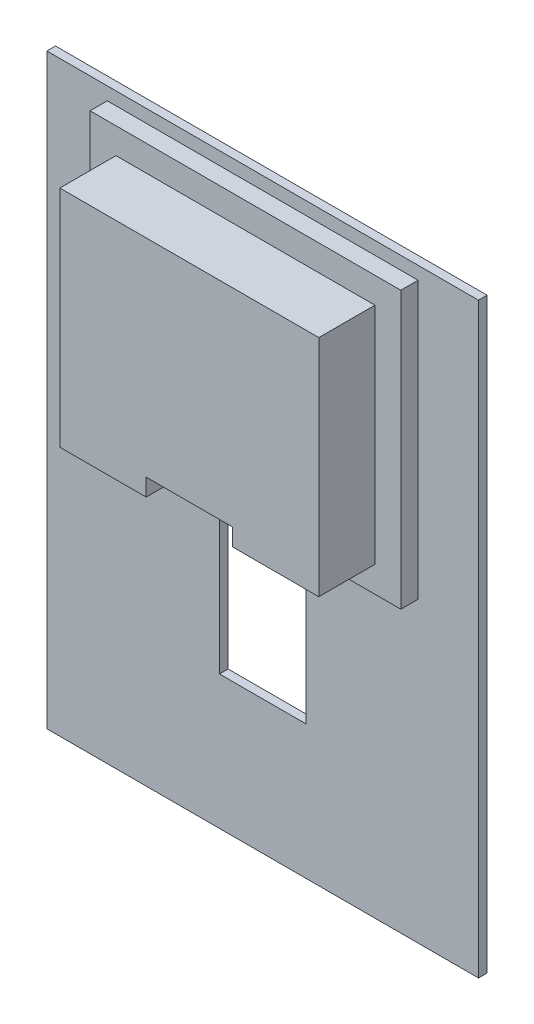
ISO-10303-21;
HEADER;
FILE_DESCRIPTION(('STEP AP214'),'2;1');
FILE_NAME('part.step','',(''),(''),'','','');
FILE_SCHEMA(('AUTOMOTIVE_DESIGN { 1 0 10303 214 1 1 1 1 }'));
ENDSEC;
DATA;
#1=APPLICATION_CONTEXT('core data for automotive mechanical design processes');
#2=APPLICATION_PROTOCOL_DEFINITION('international standard','automotive_design',2000,#1);
#3=PRODUCT_CONTEXT('',#1,'mechanical');
#4=PRODUCT('Part','Part','',(#3));
#5=PRODUCT_RELATED_PRODUCT_CATEGORY('part','',(#4));
#6=PRODUCT_DEFINITION_FORMATION('','',#4);
#7=PRODUCT_DEFINITION_CONTEXT('part definition',#1,'design');
#8=PRODUCT_DEFINITION('design','',#6,#7);
#9=PRODUCT_DEFINITION_SHAPE('','',#8);
#10=(LENGTH_UNIT() NAMED_UNIT(*) SI_UNIT(.MILLI.,.METRE.));
#11=(NAMED_UNIT(*) PLANE_ANGLE_UNIT() SI_UNIT($,.RADIAN.));
#12=(NAMED_UNIT(*) SI_UNIT($,.STERADIAN.) SOLID_ANGLE_UNIT());
#13=UNCERTAINTY_MEASURE_WITH_UNIT(LENGTH_MEASURE(1.E-05),#10,'distance_accuracy_value','');
#14=(GEOMETRIC_REPRESENTATION_CONTEXT(3) GLOBAL_UNCERTAINTY_ASSIGNED_CONTEXT((#13)) GLOBAL_UNIT_ASSIGNED_CONTEXT((#10,
#11,#12)) REPRESENTATION_CONTEXT('',''));
#15=CARTESIAN_POINT('',(0.,0.,0.));
#16=DIRECTION('',(0.,0.,1.));
#17=DIRECTION('',(1.,0.,0.));
#18=AXIS2_PLACEMENT_3D('',#15,#16,#17);
#19=CARTESIAN_POINT('',(-28.,8.99999999999999,4.));
#20=DIRECTION('',(0.,-1.,0.));
#21=DIRECTION('',(0.,0.,-1.));
#22=AXIS2_PLACEMENT_3D('',#19,#20,#21);
#23=PLANE('',#22);
#24=DIRECTION('',(1.,0.,0.));
#25=VECTOR('',#24,1.);
#26=CARTESIAN_POINT('',(-28.,8.99999999999999,17.));
#27=LINE('',#26,#25);
#28=CARTESIAN_POINT('',(-28.,8.99999999999999,17.));
#29=VERTEX_POINT('',#28);
#30=CARTESIAN_POINT('',(-10.,8.99999999999999,17.));
#31=VERTEX_POINT('',#30);
#32=EDGE_CURVE('E290',#29,#31,#27,.T.);
#33=ORIENTED_EDGE('',*,*,#32,.T.);
#34=DIRECTION('',(0.,0.,-1.));
#35=VECTOR('',#34,1.);
#36=CARTESIAN_POINT('',(-10.,8.99999999999999,4.));
#37=LINE('',#36,#35);
#38=CARTESIAN_POINT('',(-10.,8.99999999999999,4.));
#39=VERTEX_POINT('',#38);
#40=EDGE_CURVE('E278',#31,#39,#37,.T.);
#41=ORIENTED_EDGE('',*,*,#40,.T.);
#42=DIRECTION('',(1.,0.,0.));
#43=VECTOR('',#42,1.);
#44=CARTESIAN_POINT('',(-28.,8.99999999999999,4.));
#45=LINE('',#44,#43);
#46=CARTESIAN_POINT('',(-28.,8.99999999999999,4.));
#47=VERTEX_POINT('',#46);
#48=EDGE_CURVE('E332',#47,#39,#45,.T.);
#49=ORIENTED_EDGE('',*,*,#48,.F.);
#50=DIRECTION('',(0.,0.,1.));
#51=VECTOR('',#50,1.);
#52=CARTESIAN_POINT('',(-28.,8.99999999999999,4.));
#53=LINE('',#52,#51);
#54=EDGE_CURVE('E341',#47,#29,#53,.T.);
#55=ORIENTED_EDGE('',*,*,#54,.T.);
#56=EDGE_LOOP('',(#33,#41,#49,#55));
#57=FACE_BOUND('',#56,.T.);
#58=ADVANCED_FACE('F37',(#57),#23,.F.);
#59=CARTESIAN_POINT('',(-30.,6.99999999999999,19.));
#60=DIRECTION('',(0.,1.,0.));
#61=DIRECTION('',(0.,0.,1.));
#62=AXIS2_PLACEMENT_3D('',#59,#60,#61);
#63=PLANE('',#62);
#64=DIRECTION('',(1.,0.,0.));
#65=VECTOR('',#64,1.);
#66=CARTESIAN_POINT('',(-30.,6.99999999999999,6.));
#67=LINE('',#66,#65);
#68=CARTESIAN_POINT('',(-30.,6.99999999999999,6.));
#69=VERTEX_POINT('',#68);
#70=CARTESIAN_POINT('',(-10.,6.99999999999999,6.));
#71=VERTEX_POINT('',#70);
#72=EDGE_CURVE('E312',#69,#71,#67,.T.);
#73=ORIENTED_EDGE('',*,*,#72,.T.);
#74=DIRECTION('',(0.,0.,1.));
#75=VECTOR('',#74,1.);
#76=CARTESIAN_POINT('',(-10.,6.99999999999999,19.));
#77=LINE('',#76,#75);
#78=CARTESIAN_POINT('',(-10.,6.99999999999999,19.));
#79=VERTEX_POINT('',#78);
#80=EDGE_CURVE('E283',#71,#79,#77,.T.);
#81=ORIENTED_EDGE('',*,*,#80,.T.);
#82=DIRECTION('',(1.,0.,0.));
#83=VECTOR('',#82,1.);
#84=CARTESIAN_POINT('',(-30.,6.99999999999999,19.));
#85=LINE('',#84,#83);
#86=CARTESIAN_POINT('',(-30.,6.99999999999999,19.));
#87=VERTEX_POINT('',#86);
#88=EDGE_CURVE('E302',#87,#79,#85,.T.);
#89=ORIENTED_EDGE('',*,*,#88,.F.);
#90=DIRECTION('',(0.,0.,-1.));
#91=VECTOR('',#90,1.);
#92=CARTESIAN_POINT('',(-30.,6.99999999999999,19.));
#93=LINE('',#92,#91);
#94=EDGE_CURVE('E326',#87,#69,#93,.T.);
#95=ORIENTED_EDGE('',*,*,#94,.T.);
#96=EDGE_LOOP('',(#73,#81,#89,#95));
#97=FACE_BOUND('',#96,.T.);
#98=ADVANCED_FACE('F575',(#97),#63,.F.);
#99=CARTESIAN_POINT('',(-28.,57.,4.));
#100=DIRECTION('',(-1.,0.,0.));
#101=DIRECTION('',(0.,-1.,0.));
#102=AXIS2_PLACEMENT_3D('',#99,#100,#101);
#103=PLANE('',#102);
#104=DIRECTION('',(0.,-1.,0.));
#105=VECTOR('',#104,1.);
#106=CARTESIAN_POINT('',(-28.,57.,17.));
#107=LINE('',#106,#105);
#108=CARTESIAN_POINT('',(-28.,57.,17.));
#109=VERTEX_POINT('',#108);
#110=EDGE_CURVE('E286',#109,#29,#107,.T.);
#111=ORIENTED_EDGE('',*,*,#110,.T.);
#112=ORIENTED_EDGE('',*,*,#54,.F.);
#113=DIRECTION('',(0.,-1.,0.));
#114=VECTOR('',#113,1.);
#115=CARTESIAN_POINT('',(-28.,57.,4.));
#116=LINE('',#115,#114);
#117=CARTESIAN_POINT('',(-28.,57.,4.));
#118=VERTEX_POINT('',#117);
#119=EDGE_CURVE('E328',#118,#47,#116,.T.);
#120=ORIENTED_EDGE('',*,*,#119,.F.);
#121=DIRECTION('',(0.,0.,1.));
#122=VECTOR('',#121,1.);
#123=CARTESIAN_POINT('',(-28.,57.,4.));
#124=LINE('',#123,#122);
#125=EDGE_CURVE('E342',#118,#109,#124,.T.);
#126=ORIENTED_EDGE('',*,*,#125,.T.);
#127=EDGE_LOOP('',(#111,#112,#120,#126));
#128=FACE_BOUND('',#127,.T.);
#129=ADVANCED_FACE('F502',(#128),#103,.F.);
#130=CARTESIAN_POINT('',(-28.,57.,4.));
#131=DIRECTION('',(0.,1.,0.));
#132=DIRECTION('',(0.,0.,1.));
#133=AXIS2_PLACEMENT_3D('',#130,#131,#132);
#134=PLANE('',#133);
#135=DIRECTION('',(-1.,0.,0.));
#136=VECTOR('',#135,1.);
#137=CARTESIAN_POINT('',(-28.,57.,17.));
#138=LINE('',#137,#136);
#139=CARTESIAN_POINT('',(28.,57.,17.));
#140=VERTEX_POINT('',#139);
#141=EDGE_CURVE('E60',#140,#109,#138,.T.);
#142=ORIENTED_EDGE('',*,*,#141,.T.);
#143=ORIENTED_EDGE('',*,*,#125,.F.);
#144=DIRECTION('',(-1.,0.,0.));
#145=VECTOR('',#144,1.);
#146=CARTESIAN_POINT('',(-28.,57.,4.));
#147=LINE('',#146,#145);
#148=CARTESIAN_POINT('',(28.,57.,4.));
#149=VERTEX_POINT('',#148);
#150=EDGE_CURVE('E338',#149,#118,#147,.T.);
#151=ORIENTED_EDGE('',*,*,#150,.F.);
#152=DIRECTION('',(0.,0.,1.));
#153=VECTOR('',#152,1.);
#154=CARTESIAN_POINT('',(28.,57.,4.));
#155=LINE('',#154,#153);
#156=EDGE_CURVE('E345',#149,#140,#155,.T.);
#157=ORIENTED_EDGE('',*,*,#156,.T.);
#158=EDGE_LOOP('',(#142,#143,#151,#157));
#159=FACE_BOUND('',#158,.T.);
#160=ADVANCED_FACE('F498',(#159),#134,.F.);
#161=CARTESIAN_POINT('',(28.,57.,4.));
#162=DIRECTION('',(1.,0.,0.));
#163=DIRECTION('',(0.,1.,0.));
#164=AXIS2_PLACEMENT_3D('',#161,#162,#163);
#165=PLANE('',#164);
#166=DIRECTION('',(0.,1.,0.));
#167=VECTOR('',#166,1.);
#168=CARTESIAN_POINT('',(28.,57.,17.));
#169=LINE('',#168,#167);
#170=CARTESIAN_POINT('',(28.,8.99999999999999,17.));
#171=VERTEX_POINT('',#170);
#172=EDGE_CURVE('E293',#171,#140,#169,.T.);
#173=ORIENTED_EDGE('',*,*,#172,.T.);
#174=ORIENTED_EDGE('',*,*,#156,.F.);
#175=DIRECTION('',(0.,1.,0.));
#176=VECTOR('',#175,1.);
#177=CARTESIAN_POINT('',(28.,57.,4.));
#178=LINE('',#177,#176);
#179=CARTESIAN_POINT('',(28.,8.99999999999999,4.));
#180=VERTEX_POINT('',#179);
#181=EDGE_CURVE('E335',#180,#149,#178,.T.);
#182=ORIENTED_EDGE('',*,*,#181,.F.);
#183=DIRECTION('',(0.,0.,1.));
#184=VECTOR('',#183,1.);
#185=CARTESIAN_POINT('',(28.,8.99999999999999,4.));
#186=LINE('',#185,#184);
#187=EDGE_CURVE('E347',#180,#171,#186,.T.);
#188=ORIENTED_EDGE('',*,*,#187,.T.);
#189=EDGE_LOOP('',(#173,#174,#182,#188));
#190=FACE_BOUND('',#189,.T.);
#191=ADVANCED_FACE('F496',(#190),#165,.F.);
#192=CARTESIAN_POINT('',(9.99999999999998,8.99999999999999,4.));
#193=VERTEX_POINT('',#192);
#194=EDGE_CURVE('E331',#193,#180,#45,.T.);
#195=ORIENTED_EDGE('',*,*,#194,.F.);
#196=DIRECTION('',(0.,0.,1.));
#197=VECTOR('',#196,1.);
#198=CARTESIAN_POINT('',(9.99999999999998,8.99999999999999,4.));
#199=LINE('',#198,#197);
#200=CARTESIAN_POINT('',(9.99999999999998,8.99999999999999,17.));
#201=VERTEX_POINT('',#200);
#202=EDGE_CURVE('E270',#193,#201,#199,.T.);
#203=ORIENTED_EDGE('',*,*,#202,.T.);
#204=EDGE_CURVE('E289',#201,#171,#27,.T.);
#205=ORIENTED_EDGE('',*,*,#204,.T.);
#206=ORIENTED_EDGE('',*,*,#187,.F.);
#207=EDGE_LOOP('',(#195,#203,#205,#206));
#208=FACE_BOUND('',#207,.T.);
#209=ADVANCED_FACE('F489',(#208),#23,.F.);
#210=CARTESIAN_POINT('',(0.,0.,6.));
#211=DIRECTION('',(0.,0.,1.));
#212=DIRECTION('',(1.,0.,0.));
#213=AXIS2_PLACEMENT_3D('',#210,#211,#212);
#214=PLANE('',#213);
#215=DIRECTION('',(0.,1.,0.));
#216=VECTOR('',#215,1.);
#217=CARTESIAN_POINT('',(-10.,0.,6.));
#218=LINE('',#217,#216);
#219=CARTESIAN_POINT('',(-10.,0.999999999999989,6.));
#220=VERTEX_POINT('',#219);
#221=EDGE_CURVE('E375',#220,#71,#218,.T.);
#222=ORIENTED_EDGE('',*,*,#221,.T.);
#223=ORIENTED_EDGE('',*,*,#72,.F.);
#224=DIRECTION('',(0.,-1.,0.));
#225=VECTOR('',#224,1.);
#226=CARTESIAN_POINT('',(-30.,59.,6.));
#227=LINE('',#226,#225);
#228=CARTESIAN_POINT('',(-30.,59.,6.));
#229=VERTEX_POINT('',#228);
#230=EDGE_CURVE('E296',#229,#69,#227,.T.);
#231=ORIENTED_EDGE('',*,*,#230,.F.);
#232=DIRECTION('',(-1.,0.,0.));
#233=VECTOR('',#232,1.);
#234=CARTESIAN_POINT('',(-30.,59.,6.));
#235=LINE('',#234,#233);
#236=CARTESIAN_POINT('',(30.,59.,6.));
#237=VERTEX_POINT('',#236);
#238=EDGE_CURVE('E301',#237,#229,#235,.T.);
#239=ORIENTED_EDGE('',*,*,#238,.F.);
#240=DIRECTION('',(0.,1.,0.));
#241=VECTOR('',#240,1.);
#242=CARTESIAN_POINT('',(30.,59.,6.));
#243=LINE('',#242,#241);
#244=CARTESIAN_POINT('',(30.,6.99999999999999,6.));
#245=VERTEX_POINT('',#244);
#246=EDGE_CURVE('E315',#245,#237,#243,.T.);
#247=ORIENTED_EDGE('',*,*,#246,.F.);
#248=CARTESIAN_POINT('',(9.99999999999998,6.99999999999999,6.));
#249=VERTEX_POINT('',#248);
#250=EDGE_CURVE('E311',#249,#245,#67,.T.);
#251=ORIENTED_EDGE('',*,*,#250,.F.);
#252=DIRECTION('',(0.,-1.,0.));
#253=VECTOR('',#252,1.);
#254=CARTESIAN_POINT('',(9.99999999999998,0.,6.));
#255=LINE('',#254,#253);
#256=CARTESIAN_POINT('',(9.99999999999998,0.999999999999989,6.));
#257=VERTEX_POINT('',#256);
#258=EDGE_CURVE('E378',#249,#257,#255,.T.);
#259=ORIENTED_EDGE('',*,*,#258,.T.);
#260=DIRECTION('',(1.,0.,0.));
#261=VECTOR('',#260,1.);
#262=CARTESIAN_POINT('',(0.,0.999999999999989,6.));
#263=LINE('',#262,#261);
#264=CARTESIAN_POINT('',(36.,0.999999999999989,6.));
#265=VERTEX_POINT('',#264);
#266=EDGE_CURVE('E376',#257,#265,#263,.T.);
#267=ORIENTED_EDGE('',*,*,#266,.T.);
#268=DIRECTION('',(0.,-1.,0.));
#269=VECTOR('',#268,1.);
#270=CARTESIAN_POINT('',(36.,0.,6.));
#271=LINE('',#270,#269);
#272=CARTESIAN_POINT('',(36.,65.,6.));
#273=VERTEX_POINT('',#272);
#274=EDGE_CURVE('E364',#273,#265,#271,.T.);
#275=ORIENTED_EDGE('',*,*,#274,.F.);
#276=DIRECTION('',(1.,0.,0.));
#277=VECTOR('',#276,1.);
#278=CARTESIAN_POINT('',(0.,65.,6.));
#279=LINE('',#278,#277);
#280=CARTESIAN_POINT('',(-36.,65.,6.));
#281=VERTEX_POINT('',#280);
#282=EDGE_CURVE('E367',#281,#273,#279,.T.);
#283=ORIENTED_EDGE('',*,*,#282,.F.);
#284=DIRECTION('',(0.,-1.,0.));
#285=VECTOR('',#284,1.);
#286=CARTESIAN_POINT('',(-36.,0.,6.));
#287=LINE('',#286,#285);
#288=CARTESIAN_POINT('',(-36.,0.999999999999989,6.));
#289=VERTEX_POINT('',#288);
#290=EDGE_CURVE('E371',#281,#289,#287,.T.);
#291=ORIENTED_EDGE('',*,*,#290,.T.);
#292=EDGE_CURVE('E373',#289,#220,#263,.T.);
#293=ORIENTED_EDGE('',*,*,#292,.T.);
#294=EDGE_LOOP('',(#222,#223,#231,#239,#247,#251,#259,#267,#275,#283,#291,#293));
#295=FACE_BOUND('',#294,.T.);
#296=ADVANCED_FACE('F553',(#295),#214,.T.);
#297=CARTESIAN_POINT('',(0.,2.99999999999999,2.));
#298=DIRECTION('',(0.,1.,0.));
#299=DIRECTION('',(0.,0.,1.));
#300=AXIS2_PLACEMENT_3D('',#297,#298,#299);
#301=PLANE('',#300);
#302=DIRECTION('',(0.,0.,-1.));
#303=VECTOR('',#302,1.);
#304=CARTESIAN_POINT('',(-34.,2.99999999999999,2.));
#305=LINE('',#304,#303);
#306=CARTESIAN_POINT('',(-34.,2.99999999999999,4.));
#307=VERTEX_POINT('',#306);
#308=CARTESIAN_POINT('',(-34.,2.99999999999999,0.));
#309=VERTEX_POINT('',#308);
#310=EDGE_CURVE('E476',#307,#309,#305,.T.);
#311=ORIENTED_EDGE('',*,*,#310,.F.);
#312=DIRECTION('',(1.,0.,0.));
#313=VECTOR('',#312,1.);
#314=CARTESIAN_POINT('',(-34.,2.99999999999999,4.));
#315=LINE('',#314,#313);
#316=CARTESIAN_POINT('',(-10.,2.99999999999999,4.));
#317=VERTEX_POINT('',#316);
#318=EDGE_CURVE('E354',#307,#317,#315,.T.);
#319=ORIENTED_EDGE('',*,*,#318,.T.);
#320=DIRECTION('',(0.,0.,-1.));
#321=VECTOR('',#320,1.);
#322=CARTESIAN_POINT('',(-10.,2.99999999999999,2.));
#323=LINE('',#322,#321);
#324=CARTESIAN_POINT('',(-10.,2.99999999999999,0.));
#325=VERTEX_POINT('',#324);
#326=EDGE_CURVE('E478',#317,#325,#323,.T.);
#327=ORIENTED_EDGE('',*,*,#326,.T.);
#328=DIRECTION('',(1.,0.,0.));
#329=VECTOR('',#328,1.);
#330=CARTESIAN_POINT('',(0.,2.99999999999999,0.));
#331=LINE('',#330,#329);
#332=EDGE_CURVE('E429',#309,#325,#331,.T.);
#333=ORIENTED_EDGE('',*,*,#332,.F.);
#334=EDGE_LOOP('',(#311,#319,#327,#333));
#335=FACE_BOUND('',#334,.T.);
#336=ADVANCED_FACE('F511',(#335),#301,.T.);
#337=CARTESIAN_POINT('',(-34.,0.,2.));
#338=DIRECTION('',(-1.,0.,0.));
#339=DIRECTION('',(0.,0.,1.));
#340=AXIS2_PLACEMENT_3D('',#337,#338,#339);
#341=PLANE('',#340);
#342=DIRECTION('',(0.,-1.,0.));
#343=VECTOR('',#342,1.);
#344=CARTESIAN_POINT('',(-34.,63.,4.));
#345=LINE('',#344,#343);
#346=CARTESIAN_POINT('',(-34.,63.,4.));
#347=VERTEX_POINT('',#346);
#348=EDGE_CURVE('E344',#347,#307,#345,.T.);
#349=ORIENTED_EDGE('',*,*,#348,.T.);
#350=ORIENTED_EDGE('',*,*,#310,.T.);
#351=DIRECTION('',(0.,1.,0.));
#352=VECTOR('',#351,1.);
#353=CARTESIAN_POINT('',(-34.,0.,0.));
#354=LINE('',#353,#352);
#355=CARTESIAN_POINT('',(-34.,63.,0.));
#356=VERTEX_POINT('',#355);
#357=EDGE_CURVE('E432',#309,#356,#354,.T.);
#358=ORIENTED_EDGE('',*,*,#357,.T.);
#359=DIRECTION('',(0.,0.,-1.));
#360=VECTOR('',#359,1.);
#361=CARTESIAN_POINT('',(-34.,63.,2.));
#362=LINE('',#361,#360);
#363=EDGE_CURVE('E474',#347,#356,#362,.T.);
#364=ORIENTED_EDGE('',*,*,#363,.F.);
#365=EDGE_LOOP('',(#349,#350,#358,#364));
#366=FACE_BOUND('',#365,.T.);
#367=ADVANCED_FACE('F515',(#366),#341,.F.);
#368=CARTESIAN_POINT('',(0.,63.,2.));
#369=DIRECTION('',(0.,1.,0.));
#370=DIRECTION('',(0.,0.,1.));
#371=AXIS2_PLACEMENT_3D('',#368,#369,#370);
#372=PLANE('',#371);
#373=DIRECTION('',(-1.,0.,0.));
#374=VECTOR('',#373,1.);
#375=CARTESIAN_POINT('',(-34.,63.,4.));
#376=LINE('',#375,#374);
#377=CARTESIAN_POINT('',(34.,63.,4.));
#378=VERTEX_POINT('',#377);
#379=EDGE_CURVE('E360',#378,#347,#376,.T.);
#380=ORIENTED_EDGE('',*,*,#379,.T.);
#381=ORIENTED_EDGE('',*,*,#363,.T.);
#382=DIRECTION('',(1.,0.,0.));
#383=VECTOR('',#382,1.);
#384=CARTESIAN_POINT('',(0.,63.,0.));
#385=LINE('',#384,#383);
#386=CARTESIAN_POINT('',(34.,63.,0.));
#387=VERTEX_POINT('',#386);
#388=EDGE_CURVE('E436',#356,#387,#385,.T.);
#389=ORIENTED_EDGE('',*,*,#388,.T.);
#390=DIRECTION('',(0.,0.,-1.));
#391=VECTOR('',#390,1.);
#392=CARTESIAN_POINT('',(34.,63.,2.));
#393=LINE('',#392,#391);
#394=EDGE_CURVE('E472',#378,#387,#393,.T.);
#395=ORIENTED_EDGE('',*,*,#394,.F.);
#396=EDGE_LOOP('',(#380,#381,#389,#395));
#397=FACE_BOUND('',#396,.T.);
#398=ADVANCED_FACE('F525',(#397),#372,.F.);
#399=CARTESIAN_POINT('',(34.,0.,2.));
#400=DIRECTION('',(-1.,0.,0.));
#401=DIRECTION('',(0.,0.,1.));
#402=AXIS2_PLACEMENT_3D('',#399,#400,#401);
#403=PLANE('',#402);
#404=DIRECTION('',(0.,0.,-1.));
#405=VECTOR('',#404,1.);
#406=CARTESIAN_POINT('',(34.,2.99999999999999,2.));
#407=LINE('',#406,#405);
#408=CARTESIAN_POINT('',(34.,2.99999999999999,4.));
#409=VERTEX_POINT('',#408);
#410=CARTESIAN_POINT('',(34.,2.99999999999999,0.));
#411=VERTEX_POINT('',#410);
#412=EDGE_CURVE('E470',#409,#411,#407,.T.);
#413=ORIENTED_EDGE('',*,*,#412,.F.);
#414=DIRECTION('',(0.,1.,0.));
#415=VECTOR('',#414,1.);
#416=CARTESIAN_POINT('',(34.,63.,4.));
#417=LINE('',#416,#415);
#418=EDGE_CURVE('E357',#409,#378,#417,.T.);
#419=ORIENTED_EDGE('',*,*,#418,.T.);
#420=ORIENTED_EDGE('',*,*,#394,.T.);
#421=DIRECTION('',(0.,1.,0.));
#422=VECTOR('',#421,1.);
#423=CARTESIAN_POINT('',(34.,0.,0.));
#424=LINE('',#423,#422);
#425=EDGE_CURVE('E439',#411,#387,#424,.T.);
#426=ORIENTED_EDGE('',*,*,#425,.F.);
#427=EDGE_LOOP('',(#413,#419,#420,#426));
#428=FACE_BOUND('',#427,.T.);
#429=ADVANCED_FACE('F529',(#428),#403,.T.);
#430=DIRECTION('',(0.,0.,-1.));
#431=VECTOR('',#430,1.);
#432=CARTESIAN_POINT('',(9.99999999999998,2.99999999999999,2.));
#433=LINE('',#432,#431);
#434=CARTESIAN_POINT('',(9.99999999999998,2.99999999999999,4.));
#435=VERTEX_POINT('',#434);
#436=CARTESIAN_POINT('',(9.99999999999998,2.99999999999999,0.));
#437=VERTEX_POINT('',#436);
#438=EDGE_CURVE('E468',#435,#437,#433,.T.);
#439=ORIENTED_EDGE('',*,*,#438,.F.);
#440=EDGE_CURVE('E353',#435,#409,#315,.T.);
#441=ORIENTED_EDGE('',*,*,#440,.T.);
#442=ORIENTED_EDGE('',*,*,#412,.T.);
#443=EDGE_CURVE('E433',#437,#411,#331,.T.);
#444=ORIENTED_EDGE('',*,*,#443,.F.);
#445=EDGE_LOOP('',(#439,#441,#442,#444));
#446=FACE_BOUND('',#445,.T.);
#447=ADVANCED_FACE('F533',(#446),#301,.T.);
#448=CARTESIAN_POINT('',(0.,-68.,2.));
#449=DIRECTION('',(0.,1.,0.));
#450=DIRECTION('',(0.,0.,1.));
#451=AXIS2_PLACEMENT_3D('',#448,#449,#450);
#452=PLANE('',#451);
#453=DIRECTION('',(1.,0.,0.));
#454=VECTOR('',#453,1.);
#455=CARTESIAN_POINT('',(0.,-68.,0.));
#456=LINE('',#455,#454);
#457=CARTESIAN_POINT('',(-50.,-68.,0.));
#458=VERTEX_POINT('',#457);
#459=CARTESIAN_POINT('',(50.,-68.,0.));
#460=VERTEX_POINT('',#459);
#461=EDGE_CURVE('E444',#458,#460,#456,.T.);
#462=ORIENTED_EDGE('',*,*,#461,.T.);
#463=DIRECTION('',(0.,0.,-1.));
#464=VECTOR('',#463,1.);
#465=CARTESIAN_POINT('',(50.,-68.,2.));
#466=LINE('',#465,#464);
#467=CARTESIAN_POINT('',(50.,-68.,2.));
#468=VERTEX_POINT('',#467);
#469=EDGE_CURVE('E462',#468,#460,#466,.T.);
#470=ORIENTED_EDGE('',*,*,#469,.F.);
#471=DIRECTION('',(1.,0.,0.));
#472=VECTOR('',#471,1.);
#473=CARTESIAN_POINT('',(0.,-68.,2.));
#474=LINE('',#473,#472);
#475=CARTESIAN_POINT('',(-50.,-68.,2.));
#476=VERTEX_POINT('',#475);
#477=EDGE_CURVE('E413',#476,#468,#474,.T.);
#478=ORIENTED_EDGE('',*,*,#477,.F.);
#479=DIRECTION('',(0.,0.,-1.));
#480=VECTOR('',#479,1.);
#481=CARTESIAN_POINT('',(-50.,-68.,2.));
#482=LINE('',#481,#480);
#483=EDGE_CURVE('E455',#476,#458,#482,.T.);
#484=ORIENTED_EDGE('',*,*,#483,.T.);
#485=EDGE_LOOP('',(#462,#470,#478,#484));
#486=FACE_BOUND('',#485,.T.);
#487=ADVANCED_FACE('F745',(#486),#452,.F.);
#488=CARTESIAN_POINT('',(50.,0.,2.));
#489=DIRECTION('',(-1.,0.,0.));
#490=DIRECTION('',(0.,0.,1.));
#491=AXIS2_PLACEMENT_3D('',#488,#489,#490);
#492=PLANE('',#491);
#493=DIRECTION('',(0.,1.,0.));
#494=VECTOR('',#493,1.);
#495=CARTESIAN_POINT('',(50.,0.,0.));
#496=LINE('',#495,#494);
#497=CARTESIAN_POINT('',(50.,68.,0.));
#498=VERTEX_POINT('',#497);
#499=EDGE_CURVE('E447',#460,#498,#496,.T.);
#500=ORIENTED_EDGE('',*,*,#499,.T.);
#501=DIRECTION('',(0.,0.,-1.));
#502=VECTOR('',#501,1.);
#503=CARTESIAN_POINT('',(50.,68.,2.));
#504=LINE('',#503,#502);
#505=CARTESIAN_POINT('',(50.,68.,2.));
#506=VERTEX_POINT('',#505);
#507=EDGE_CURVE('E460',#506,#498,#504,.T.);
#508=ORIENTED_EDGE('',*,*,#507,.F.);
#509=DIRECTION('',(0.,1.,0.));
#510=VECTOR('',#509,1.);
#511=CARTESIAN_POINT('',(50.,0.,2.));
#512=LINE('',#511,#510);
#513=EDGE_CURVE('E416',#468,#506,#512,.T.);
#514=ORIENTED_EDGE('',*,*,#513,.F.);
#515=ORIENTED_EDGE('',*,*,#469,.T.);
#516=EDGE_LOOP('',(#500,#508,#514,#515));
#517=FACE_BOUND('',#516,.T.);
#518=ADVANCED_FACE('F735',(#517),#492,.F.);
#519=CARTESIAN_POINT('',(0.,68.,2.));
#520=DIRECTION('',(0.,1.,0.));
#521=DIRECTION('',(0.,0.,1.));
#522=AXIS2_PLACEMENT_3D('',#519,#520,#521);
#523=PLANE('',#522);
#524=DIRECTION('',(1.,0.,0.));
#525=VECTOR('',#524,1.);
#526=CARTESIAN_POINT('',(0.,68.,0.));
#527=LINE('',#526,#525);
#528=CARTESIAN_POINT('',(-50.,68.,0.));
#529=VERTEX_POINT('',#528);
#530=EDGE_CURVE('E450',#529,#498,#527,.T.);
#531=ORIENTED_EDGE('',*,*,#530,.F.);
#532=DIRECTION('',(0.,0.,-1.));
#533=VECTOR('',#532,1.);
#534=CARTESIAN_POINT('',(-50.,68.,2.));
#535=LINE('',#534,#533);
#536=CARTESIAN_POINT('',(-50.,68.,2.));
#537=VERTEX_POINT('',#536);
#538=EDGE_CURVE('E457',#537,#529,#535,.T.);
#539=ORIENTED_EDGE('',*,*,#538,.F.);
#540=DIRECTION('',(1.,0.,0.));
#541=VECTOR('',#540,1.);
#542=CARTESIAN_POINT('',(0.,68.,2.));
#543=LINE('',#542,#541);
#544=EDGE_CURVE('E418',#537,#506,#543,.T.);
#545=ORIENTED_EDGE('',*,*,#544,.T.);
#546=ORIENTED_EDGE('',*,*,#507,.T.);
#547=EDGE_LOOP('',(#531,#539,#545,#546));
#548=FACE_BOUND('',#547,.T.);
#549=ADVANCED_FACE('F725',(#548),#523,.T.);
#550=CARTESIAN_POINT('',(0.,-37.,2.));
#551=DIRECTION('',(0.,1.,0.));
#552=DIRECTION('',(0.,0.,1.));
#553=AXIS2_PLACEMENT_3D('',#550,#551,#552);
#554=PLANE('',#553);
#555=DIRECTION('',(1.,0.,0.));
#556=VECTOR('',#555,1.);
#557=CARTESIAN_POINT('',(0.,-37.,0.));
#558=LINE('',#557,#556);
#559=CARTESIAN_POINT('',(-10.,-37.,0.));
#560=VERTEX_POINT('',#559);
#561=CARTESIAN_POINT('',(9.99999999999999,-37.,0.));
#562=VERTEX_POINT('',#561);
#563=EDGE_CURVE('E404',#560,#562,#558,.T.);
#564=ORIENTED_EDGE('',*,*,#563,.F.);
#565=DIRECTION('',(0.,0.,-1.));
#566=VECTOR('',#565,1.);
#567=CARTESIAN_POINT('',(-10.,-37.,2.));
#568=LINE('',#567,#566);
#569=CARTESIAN_POINT('',(-10.,-37.,2.));
#570=VERTEX_POINT('',#569);
#571=EDGE_CURVE('E458',#570,#560,#568,.T.);
#572=ORIENTED_EDGE('',*,*,#571,.F.);
#573=DIRECTION('',(1.,0.,0.));
#574=VECTOR('',#573,1.);
#575=CARTESIAN_POINT('',(0.,-37.,2.));
#576=LINE('',#575,#574);
#577=CARTESIAN_POINT('',(9.99999999999999,-37.,2.));
#578=VERTEX_POINT('',#577);
#579=EDGE_CURVE('E405',#570,#578,#576,.T.);
#580=ORIENTED_EDGE('',*,*,#579,.T.);
#581=DIRECTION('',(0.,0.,-1.));
#582=VECTOR('',#581,1.);
#583=CARTESIAN_POINT('',(9.99999999999999,-37.,2.));
#584=LINE('',#583,#582);
#585=EDGE_CURVE('E424',#578,#562,#584,.T.);
#586=ORIENTED_EDGE('',*,*,#585,.T.);
#587=EDGE_LOOP('',(#564,#572,#580,#586));
#588=FACE_BOUND('',#587,.T.);
#589=ADVANCED_FACE('F39',(#588),#554,.T.);
#590=CARTESIAN_POINT('',(-10.,0.,2.));
#591=DIRECTION('',(1.,0.,0.));
#592=DIRECTION('',(0.,1.,0.));
#593=AXIS2_PLACEMENT_3D('',#590,#591,#592);
#594=PLANE('',#593);
#595=ORIENTED_EDGE('',*,*,#571,.T.);
#596=DIRECTION('',(0.,-1.,0.));
#597=VECTOR('',#596,1.);
#598=CARTESIAN_POINT('',(-10.,0.,0.));
#599=LINE('',#598,#597);
#600=EDGE_CURVE('E427',#325,#560,#599,.T.);
#601=ORIENTED_EDGE('',*,*,#600,.F.);
#602=ORIENTED_EDGE('',*,*,#326,.F.);
#603=DIRECTION('',(0.,-1.,0.));
#604=VECTOR('',#603,1.);
#605=CARTESIAN_POINT('',(-10.,0.,4.));
#606=LINE('',#605,#604);
#607=EDGE_CURVE('E281',#39,#317,#606,.T.);
#608=ORIENTED_EDGE('',*,*,#607,.F.);
#609=ORIENTED_EDGE('',*,*,#40,.F.);
#610=DIRECTION('',(0.,-1.,0.));
#611=VECTOR('',#610,1.);
#612=CARTESIAN_POINT('',(-10.,0.,17.));
#613=LINE('',#612,#611);
#614=CARTESIAN_POINT('',(-10.,11.,17.));
#615=VERTEX_POINT('',#614);
#616=EDGE_CURVE('E11',#615,#31,#613,.T.);
#617=ORIENTED_EDGE('',*,*,#616,.F.);
#618=DIRECTION('',(0.,0.,1.));
#619=VECTOR('',#618,1.);
#620=CARTESIAN_POINT('',(-10.,11.,-16.));
#621=LINE('',#620,#619);
#622=CARTESIAN_POINT('',(-10.,11.,19.));
#623=VERTEX_POINT('',#622);
#624=EDGE_CURVE('E253',#615,#623,#621,.T.);
#625=ORIENTED_EDGE('',*,*,#624,.T.);
#626=DIRECTION('',(0.,-1.,0.));
#627=VECTOR('',#626,1.);
#628=CARTESIAN_POINT('',(-10.,0.999999999999989,19.));
#629=LINE('',#628,#627);
#630=EDGE_CURVE('E263',#623,#79,#629,.T.);
#631=ORIENTED_EDGE('',*,*,#630,.T.);
#632=ORIENTED_EDGE('',*,*,#80,.F.);
#633=ORIENTED_EDGE('',*,*,#221,.F.);
#634=DIRECTION('',(0.,0.,-1.));
#635=VECTOR('',#634,1.);
#636=CARTESIAN_POINT('',(-10.,0.999999999999989,6.));
#637=LINE('',#636,#635);
#638=CARTESIAN_POINT('',(-10.,0.999999999999989,2.));
#639=VERTEX_POINT('',#638);
#640=EDGE_CURVE('E393',#220,#639,#637,.T.);
#641=ORIENTED_EDGE('',*,*,#640,.T.);
#642=DIRECTION('',(0.,-1.,0.));
#643=VECTOR('',#642,1.);
#644=CARTESIAN_POINT('',(-10.,0.,2.));
#645=LINE('',#644,#643);
#646=EDGE_CURVE('E408',#639,#570,#645,.T.);
#647=ORIENTED_EDGE('',*,*,#646,.T.);
#648=EDGE_LOOP('',(#595,#601,#602,#608,#609,#617,#625,#631,#632,#633,#641,#647));
#649=FACE_BOUND('',#648,.T.);
#650=ADVANCED_FACE('F506',(#649),#594,.T.);
#651=CARTESIAN_POINT('',(9.99999999999998,0.,2.));
#652=DIRECTION('',(1.,0.,0.));
#653=DIRECTION('',(0.,1.,0.));
#654=AXIS2_PLACEMENT_3D('',#651,#652,#653);
#655=PLANE('',#654);
#656=DIRECTION('',(0.,-1.,0.));
#657=VECTOR('',#656,1.);
#658=CARTESIAN_POINT('',(9.99999999999998,0.,2.));
#659=LINE('',#658,#657);
#660=CARTESIAN_POINT('',(9.99999999999998,0.999999999999989,2.));
#661=VERTEX_POINT('',#660);
#662=EDGE_CURVE('E411',#661,#578,#659,.T.);
#663=ORIENTED_EDGE('',*,*,#662,.F.);
#664=DIRECTION('',(0.,0.,-1.));
#665=VECTOR('',#664,1.);
#666=CARTESIAN_POINT('',(9.99999999999998,0.999999999999989,6.));
#667=LINE('',#666,#665);
#668=EDGE_CURVE('E391',#257,#661,#667,.T.);
#669=ORIENTED_EDGE('',*,*,#668,.F.);
#670=ORIENTED_EDGE('',*,*,#258,.F.);
#671=DIRECTION('',(0.,0.,-1.));
#672=VECTOR('',#671,1.);
#673=CARTESIAN_POINT('',(9.99999999999998,6.99999999999999,19.));
#674=LINE('',#673,#672);
#675=CARTESIAN_POINT('',(9.99999999999998,6.99999999999999,19.));
#676=VERTEX_POINT('',#675);
#677=EDGE_CURVE('E260',#676,#249,#674,.T.);
#678=ORIENTED_EDGE('',*,*,#677,.F.);
#679=DIRECTION('',(0.,1.,0.));
#680=VECTOR('',#679,1.);
#681=CARTESIAN_POINT('',(9.99999999999998,0.999999999999989,19.));
#682=LINE('',#681,#680);
#683=CARTESIAN_POINT('',(9.99999999999998,11.,19.));
#684=VERTEX_POINT('',#683);
#685=EDGE_CURVE('E256',#676,#684,#682,.T.);
#686=ORIENTED_EDGE('',*,*,#685,.T.);
#687=DIRECTION('',(0.,0.,1.));
#688=VECTOR('',#687,1.);
#689=CARTESIAN_POINT('',(9.99999999999998,11.,-16.));
#690=LINE('',#689,#688);
#691=CARTESIAN_POINT('',(9.99999999999998,11.,17.));
#692=VERTEX_POINT('',#691);
#693=EDGE_CURVE('E52',#692,#684,#690,.T.);
#694=ORIENTED_EDGE('',*,*,#693,.F.);
#695=DIRECTION('',(0.,1.,0.));
#696=VECTOR('',#695,1.);
#697=CARTESIAN_POINT('',(9.99999999999998,0.,17.));
#698=LINE('',#697,#696);
#699=EDGE_CURVE('E465',#201,#692,#698,.T.);
#700=ORIENTED_EDGE('',*,*,#699,.F.);
#701=ORIENTED_EDGE('',*,*,#202,.F.);
#702=DIRECTION('',(0.,1.,0.));
#703=VECTOR('',#702,1.);
#704=CARTESIAN_POINT('',(9.99999999999998,0.,4.));
#705=LINE('',#704,#703);
#706=EDGE_CURVE('E274',#435,#193,#705,.T.);
#707=ORIENTED_EDGE('',*,*,#706,.F.);
#708=ORIENTED_EDGE('',*,*,#438,.T.);
#709=DIRECTION('',(0.,-1.,0.));
#710=VECTOR('',#709,1.);
#711=CARTESIAN_POINT('',(9.99999999999998,0.,0.));
#712=LINE('',#711,#710);
#713=EDGE_CURVE('E442',#437,#562,#712,.T.);
#714=ORIENTED_EDGE('',*,*,#713,.T.);
#715=ORIENTED_EDGE('',*,*,#585,.F.);
#716=EDGE_LOOP('',(#663,#669,#670,#678,#686,#694,#700,#701,#707,#708,#714,#715));
#717=FACE_BOUND('',#716,.T.);
#718=ADVANCED_FACE('F258',(#717),#655,.F.);
#719=CARTESIAN_POINT('',(-50.,0.,2.));
#720=DIRECTION('',(-1.,0.,0.));
#721=DIRECTION('',(0.,0.,1.));
#722=AXIS2_PLACEMENT_3D('',#719,#720,#721);
#723=PLANE('',#722);
#724=DIRECTION('',(0.,1.,0.));
#725=VECTOR('',#724,1.);
#726=CARTESIAN_POINT('',(-50.,0.,0.));
#727=LINE('',#726,#725);
#728=EDGE_CURVE('E409',#458,#529,#727,.T.);
#729=ORIENTED_EDGE('',*,*,#728,.F.);
#730=ORIENTED_EDGE('',*,*,#483,.F.);
#731=DIRECTION('',(0.,1.,0.));
#732=VECTOR('',#731,1.);
#733=CARTESIAN_POINT('',(-50.,0.,2.));
#734=LINE('',#733,#732);
#735=EDGE_CURVE('E421',#476,#537,#734,.T.);
#736=ORIENTED_EDGE('',*,*,#735,.T.);
#737=ORIENTED_EDGE('',*,*,#538,.T.);
#738=EDGE_LOOP('',(#729,#730,#736,#737));
#739=FACE_BOUND('',#738,.T.);
#740=ADVANCED_FACE('F705',(#739),#723,.T.);
#741=CARTESIAN_POINT('',(0.,0.,2.));
#742=DIRECTION('',(0.,0.,1.));
#743=DIRECTION('',(1.,0.,0.));
#744=AXIS2_PLACEMENT_3D('',#741,#742,#743);
#745=PLANE('',#744);
#746=DIRECTION('',(1.,0.,0.));
#747=VECTOR('',#746,1.);
#748=CARTESIAN_POINT('',(0.,0.999999999999989,2.));
#749=LINE('',#748,#747);
#750=CARTESIAN_POINT('',(36.,0.999999999999989,2.));
#751=VERTEX_POINT('',#750);
#752=EDGE_CURVE('E368',#661,#751,#749,.T.);
#753=ORIENTED_EDGE('',*,*,#752,.F.);
#754=ORIENTED_EDGE('',*,*,#662,.T.);
#755=ORIENTED_EDGE('',*,*,#579,.F.);
#756=ORIENTED_EDGE('',*,*,#646,.F.);
#757=CARTESIAN_POINT('',(-36.,0.999999999999989,2.));
#758=VERTEX_POINT('',#757);
#759=EDGE_CURVE('E387',#758,#639,#749,.T.);
#760=ORIENTED_EDGE('',*,*,#759,.F.);
#761=DIRECTION('',(0.,-1.,0.));
#762=VECTOR('',#761,1.);
#763=CARTESIAN_POINT('',(-36.,0.,2.));
#764=LINE('',#763,#762);
#765=CARTESIAN_POINT('',(-36.,65.,2.));
#766=VERTEX_POINT('',#765);
#767=EDGE_CURVE('E385',#766,#758,#764,.T.);
#768=ORIENTED_EDGE('',*,*,#767,.F.);
#769=DIRECTION('',(1.,0.,0.));
#770=VECTOR('',#769,1.);
#771=CARTESIAN_POINT('',(0.,65.,2.));
#772=LINE('',#771,#770);
#773=CARTESIAN_POINT('',(36.,65.,2.));
#774=VERTEX_POINT('',#773);
#775=EDGE_CURVE('E382',#766,#774,#772,.T.);
#776=ORIENTED_EDGE('',*,*,#775,.T.);
#777=DIRECTION('',(0.,-1.,0.));
#778=VECTOR('',#777,1.);
#779=CARTESIAN_POINT('',(36.,0.,2.));
#780=LINE('',#779,#778);
#781=EDGE_CURVE('E363',#774,#751,#780,.T.);
#782=ORIENTED_EDGE('',*,*,#781,.T.);
#783=EDGE_LOOP('',(#753,#754,#755,#756,#760,#768,#776,#782));
#784=FACE_BOUND('',#783,.T.);
#785=ORIENTED_EDGE('',*,*,#477,.T.);
#786=ORIENTED_EDGE('',*,*,#513,.T.);
#787=ORIENTED_EDGE('',*,*,#544,.F.);
#788=ORIENTED_EDGE('',*,*,#735,.F.);
#789=EDGE_LOOP('',(#785,#786,#787,#788));
#790=FACE_BOUND('',#789,.T.);
#791=ADVANCED_FACE('F544',(#784,#790),#745,.T.);
#792=CARTESIAN_POINT('',(0.,0.,0.));
#793=DIRECTION('',(0.,0.,1.));
#794=DIRECTION('',(1.,0.,0.));
#795=AXIS2_PLACEMENT_3D('',#792,#793,#794);
#796=PLANE('',#795);
#797=ORIENTED_EDGE('',*,*,#563,.T.);
#798=ORIENTED_EDGE('',*,*,#713,.F.);
#799=ORIENTED_EDGE('',*,*,#443,.T.);
#800=ORIENTED_EDGE('',*,*,#425,.T.);
#801=ORIENTED_EDGE('',*,*,#388,.F.);
#802=ORIENTED_EDGE('',*,*,#357,.F.);
#803=ORIENTED_EDGE('',*,*,#332,.T.);
#804=ORIENTED_EDGE('',*,*,#600,.T.);
#805=EDGE_LOOP('',(#797,#798,#799,#800,#801,#802,#803,#804));
#806=FACE_BOUND('',#805,.T.);
#807=ORIENTED_EDGE('',*,*,#461,.F.);
#808=ORIENTED_EDGE('',*,*,#728,.T.);
#809=ORIENTED_EDGE('',*,*,#530,.T.);
#810=ORIENTED_EDGE('',*,*,#499,.F.);
#811=EDGE_LOOP('',(#807,#808,#809,#810));
#812=FACE_BOUND('',#811,.T.);
#813=ADVANCED_FACE('F519',(#806,#812),#796,.F.);
#814=CARTESIAN_POINT('',(36.,0.,6.));
#815=DIRECTION('',(1.,0.,0.));
#816=DIRECTION('',(0.,1.,0.));
#817=AXIS2_PLACEMENT_3D('',#814,#815,#816);
#818=PLANE('',#817);
#819=ORIENTED_EDGE('',*,*,#781,.F.);
#820=DIRECTION('',(0.,0.,-1.));
#821=VECTOR('',#820,1.);
#822=CARTESIAN_POINT('',(36.,65.,6.));
#823=LINE('',#822,#821);
#824=EDGE_CURVE('E401',#273,#774,#823,.T.);
#825=ORIENTED_EDGE('',*,*,#824,.F.);
#826=ORIENTED_EDGE('',*,*,#274,.T.);
#827=DIRECTION('',(0.,0.,-1.));
#828=VECTOR('',#827,1.);
#829=CARTESIAN_POINT('',(36.,0.999999999999989,6.));
#830=LINE('',#829,#828);
#831=EDGE_CURVE('E389',#265,#751,#830,.T.);
#832=ORIENTED_EDGE('',*,*,#831,.T.);
#833=EDGE_LOOP('',(#819,#825,#826,#832));
#834=FACE_BOUND('',#833,.T.);
#835=ADVANCED_FACE('F593',(#834),#818,.T.);
#836=CARTESIAN_POINT('',(0.,65.,6.));
#837=DIRECTION('',(0.,1.,0.));
#838=DIRECTION('',(0.,0.,1.));
#839=AXIS2_PLACEMENT_3D('',#836,#837,#838);
#840=PLANE('',#839);
#841=ORIENTED_EDGE('',*,*,#775,.F.);
#842=DIRECTION('',(0.,0.,-1.));
#843=VECTOR('',#842,1.);
#844=CARTESIAN_POINT('',(-36.,65.,6.));
#845=LINE('',#844,#843);
#846=EDGE_CURVE('E399',#281,#766,#845,.T.);
#847=ORIENTED_EDGE('',*,*,#846,.F.);
#848=ORIENTED_EDGE('',*,*,#282,.T.);
#849=ORIENTED_EDGE('',*,*,#824,.T.);
#850=EDGE_LOOP('',(#841,#847,#848,#849));
#851=FACE_BOUND('',#850,.T.);
#852=ADVANCED_FACE('F591',(#851),#840,.T.);
#853=CARTESIAN_POINT('',(-36.,0.,6.));
#854=DIRECTION('',(1.,0.,0.));
#855=DIRECTION('',(0.,1.,0.));
#856=AXIS2_PLACEMENT_3D('',#853,#854,#855);
#857=PLANE('',#856);
#858=ORIENTED_EDGE('',*,*,#767,.T.);
#859=DIRECTION('',(0.,0.,-1.));
#860=VECTOR('',#859,1.);
#861=CARTESIAN_POINT('',(-36.,0.999999999999989,6.));
#862=LINE('',#861,#860);
#863=EDGE_CURVE('E396',#289,#758,#862,.T.);
#864=ORIENTED_EDGE('',*,*,#863,.F.);
#865=ORIENTED_EDGE('',*,*,#290,.F.);
#866=ORIENTED_EDGE('',*,*,#846,.T.);
#867=EDGE_LOOP('',(#858,#864,#865,#866));
#868=FACE_BOUND('',#867,.T.);
#869=ADVANCED_FACE('F589',(#868),#857,.F.);
#870=CARTESIAN_POINT('',(0.,0.999999999999989,6.));
#871=DIRECTION('',(0.,1.,0.));
#872=DIRECTION('',(0.,0.,1.));
#873=AXIS2_PLACEMENT_3D('',#870,#871,#872);
#874=PLANE('',#873);
#875=ORIENTED_EDGE('',*,*,#759,.T.);
#876=ORIENTED_EDGE('',*,*,#640,.F.);
#877=ORIENTED_EDGE('',*,*,#292,.F.);
#878=ORIENTED_EDGE('',*,*,#863,.T.);
#879=EDGE_LOOP('',(#875,#876,#877,#878));
#880=FACE_BOUND('',#879,.T.);
#881=ADVANCED_FACE('F584',(#880),#874,.F.);
#882=ORIENTED_EDGE('',*,*,#752,.T.);
#883=ORIENTED_EDGE('',*,*,#831,.F.);
#884=ORIENTED_EDGE('',*,*,#266,.F.);
#885=ORIENTED_EDGE('',*,*,#668,.T.);
#886=EDGE_LOOP('',(#882,#883,#884,#885));
#887=FACE_BOUND('',#886,.T.);
#888=ADVANCED_FACE('F550',(#887),#874,.F.);
#889=CARTESIAN_POINT('',(0.,0.,4.));
#890=DIRECTION('',(0.,0.,1.));
#891=DIRECTION('',(1.,0.,0.));
#892=AXIS2_PLACEMENT_3D('',#889,#890,#891);
#893=PLANE('',#892);
#894=ORIENTED_EDGE('',*,*,#48,.T.);
#895=ORIENTED_EDGE('',*,*,#607,.T.);
#896=ORIENTED_EDGE('',*,*,#318,.F.);
#897=ORIENTED_EDGE('',*,*,#348,.F.);
#898=ORIENTED_EDGE('',*,*,#379,.F.);
#899=ORIENTED_EDGE('',*,*,#418,.F.);
#900=ORIENTED_EDGE('',*,*,#440,.F.);
#901=ORIENTED_EDGE('',*,*,#706,.T.);
#902=ORIENTED_EDGE('',*,*,#194,.T.);
#903=ORIENTED_EDGE('',*,*,#181,.T.);
#904=ORIENTED_EDGE('',*,*,#150,.T.);
#905=ORIENTED_EDGE('',*,*,#119,.T.);
#906=EDGE_LOOP('',(#894,#895,#896,#897,#898,#899,#900,#901,#902,#903,#904,#905));
#907=FACE_BOUND('',#906,.T.);
#908=ADVANCED_FACE('F493',(#907),#893,.F.);
#909=CARTESIAN_POINT('',(0.,0.,19.));
#910=DIRECTION('',(0.,0.,1.));
#911=DIRECTION('',(1.,0.,0.));
#912=AXIS2_PLACEMENT_3D('',#909,#910,#911);
#913=PLANE('',#912);
#914=ORIENTED_EDGE('',*,*,#630,.F.);
#915=DIRECTION('',(-1.,0.,0.));
#916=VECTOR('',#915,1.);
#917=CARTESIAN_POINT('',(-10.,11.,19.));
#918=LINE('',#917,#916);
#919=EDGE_CURVE('E249',#684,#623,#918,.T.);
#920=ORIENTED_EDGE('',*,*,#919,.F.);
#921=ORIENTED_EDGE('',*,*,#685,.F.);
#922=CARTESIAN_POINT('',(30.,6.99999999999999,19.));
#923=VERTEX_POINT('',#922);
#924=EDGE_CURVE('E300',#676,#923,#85,.T.);
#925=ORIENTED_EDGE('',*,*,#924,.T.);
#926=DIRECTION('',(0.,1.,0.));
#927=VECTOR('',#926,1.);
#928=CARTESIAN_POINT('',(30.,59.,19.));
#929=LINE('',#928,#927);
#930=CARTESIAN_POINT('',(30.,59.,19.));
#931=VERTEX_POINT('',#930);
#932=EDGE_CURVE('E304',#923,#931,#929,.T.);
#933=ORIENTED_EDGE('',*,*,#932,.T.);
#934=DIRECTION('',(-1.,0.,0.));
#935=VECTOR('',#934,1.);
#936=CARTESIAN_POINT('',(-30.,59.,19.));
#937=LINE('',#936,#935);
#938=CARTESIAN_POINT('',(-30.,59.,19.));
#939=VERTEX_POINT('',#938);
#940=EDGE_CURVE('E306',#931,#939,#937,.T.);
#941=ORIENTED_EDGE('',*,*,#940,.T.);
#942=DIRECTION('',(0.,-1.,0.));
#943=VECTOR('',#942,1.);
#944=CARTESIAN_POINT('',(-30.,59.,19.));
#945=LINE('',#944,#943);
#946=EDGE_CURVE('E297',#939,#87,#945,.T.);
#947=ORIENTED_EDGE('',*,*,#946,.T.);
#948=ORIENTED_EDGE('',*,*,#88,.T.);
#949=EDGE_LOOP('',(#914,#920,#921,#925,#933,#941,#947,#948));
#950=FACE_BOUND('',#949,.T.);
#951=ADVANCED_FACE('F265',(#950),#913,.T.);
#952=CARTESIAN_POINT('',(-30.,59.,19.));
#953=DIRECTION('',(1.,0.,0.));
#954=DIRECTION('',(0.,1.,0.));
#955=AXIS2_PLACEMENT_3D('',#952,#953,#954);
#956=PLANE('',#955);
#957=ORIENTED_EDGE('',*,*,#230,.T.);
#958=ORIENTED_EDGE('',*,*,#94,.F.);
#959=ORIENTED_EDGE('',*,*,#946,.F.);
#960=DIRECTION('',(0.,0.,-1.));
#961=VECTOR('',#960,1.);
#962=CARTESIAN_POINT('',(-30.,59.,19.));
#963=LINE('',#962,#961);
#964=EDGE_CURVE('E308',#939,#229,#963,.T.);
#965=ORIENTED_EDGE('',*,*,#964,.T.);
#966=EDGE_LOOP('',(#957,#958,#959,#965));
#967=FACE_BOUND('',#966,.T.);
#968=ADVANCED_FACE('F573',(#967),#956,.F.);
#969=ORIENTED_EDGE('',*,*,#924,.F.);
#970=ORIENTED_EDGE('',*,*,#677,.T.);
#971=ORIENTED_EDGE('',*,*,#250,.T.);
#972=DIRECTION('',(0.,0.,-1.));
#973=VECTOR('',#972,1.);
#974=CARTESIAN_POINT('',(30.,6.99999999999999,19.));
#975=LINE('',#974,#973);
#976=EDGE_CURVE('E323',#923,#245,#975,.T.);
#977=ORIENTED_EDGE('',*,*,#976,.F.);
#978=EDGE_LOOP('',(#969,#970,#971,#977));
#979=FACE_BOUND('',#978,.T.);
#980=ADVANCED_FACE('F558',(#979),#63,.F.);
#981=CARTESIAN_POINT('',(30.,59.,19.));
#982=DIRECTION('',(-1.,0.,0.));
#983=DIRECTION('',(0.,-1.,0.));
#984=AXIS2_PLACEMENT_3D('',#981,#982,#983);
#985=PLANE('',#984);
#986=ORIENTED_EDGE('',*,*,#246,.T.);
#987=DIRECTION('',(0.,0.,-1.));
#988=VECTOR('',#987,1.);
#989=CARTESIAN_POINT('',(30.,59.,19.));
#990=LINE('',#989,#988);
#991=EDGE_CURVE('E321',#931,#237,#990,.T.);
#992=ORIENTED_EDGE('',*,*,#991,.F.);
#993=ORIENTED_EDGE('',*,*,#932,.F.);
#994=ORIENTED_EDGE('',*,*,#976,.T.);
#995=EDGE_LOOP('',(#986,#992,#993,#994));
#996=FACE_BOUND('',#995,.T.);
#997=ADVANCED_FACE('F565',(#996),#985,.F.);
#998=CARTESIAN_POINT('',(-30.,59.,19.));
#999=DIRECTION('',(0.,-1.,0.));
#1000=DIRECTION('',(0.,0.,-1.));
#1001=AXIS2_PLACEMENT_3D('',#998,#999,#1000);
#1002=PLANE('',#1001);
#1003=ORIENTED_EDGE('',*,*,#238,.T.);
#1004=ORIENTED_EDGE('',*,*,#964,.F.);
#1005=ORIENTED_EDGE('',*,*,#940,.F.);
#1006=ORIENTED_EDGE('',*,*,#991,.T.);
#1007=EDGE_LOOP('',(#1003,#1004,#1005,#1006));
#1008=FACE_BOUND('',#1007,.T.);
#1009=ADVANCED_FACE('F568',(#1008),#1002,.F.);
#1010=CARTESIAN_POINT('',(0.,0.,17.));
#1011=DIRECTION('',(0.,0.,1.));
#1012=DIRECTION('',(1.,0.,0.));
#1013=AXIS2_PLACEMENT_3D('',#1010,#1011,#1012);
#1014=PLANE('',#1013);
#1015=DIRECTION('',(-1.,0.,0.));
#1016=VECTOR('',#1015,1.);
#1017=CARTESIAN_POINT('',(0.,11.,17.));
#1018=LINE('',#1017,#1016);
#1019=EDGE_CURVE('E45',#692,#615,#1018,.T.);
#1020=ORIENTED_EDGE('',*,*,#1019,.T.);
#1021=ORIENTED_EDGE('',*,*,#616,.T.);
#1022=ORIENTED_EDGE('',*,*,#32,.F.);
#1023=ORIENTED_EDGE('',*,*,#110,.F.);
#1024=ORIENTED_EDGE('',*,*,#141,.F.);
#1025=ORIENTED_EDGE('',*,*,#172,.F.);
#1026=ORIENTED_EDGE('',*,*,#204,.F.);
#1027=ORIENTED_EDGE('',*,*,#699,.T.);
#1028=EDGE_LOOP('',(#1020,#1021,#1022,#1023,#1024,#1025,#1026,#1027));
#1029=FACE_BOUND('',#1028,.T.);
#1030=ADVANCED_FACE('F483',(#1029),#1014,.F.);
#1031=CARTESIAN_POINT('',(-10.,11.,-16.));
#1032=DIRECTION('',(0.,1.,0.));
#1033=DIRECTION('',(0.,0.,1.));
#1034=AXIS2_PLACEMENT_3D('',#1031,#1032,#1033);
#1035=PLANE('',#1034);
#1036=ORIENTED_EDGE('',*,*,#693,.T.);
#1037=ORIENTED_EDGE('',*,*,#919,.T.);
#1038=ORIENTED_EDGE('',*,*,#624,.F.);
#1039=ORIENTED_EDGE('',*,*,#1019,.F.);
#1040=EDGE_LOOP('',(#1036,#1037,#1038,#1039));
#1041=FACE_BOUND('',#1040,.T.);
#1042=ADVANCED_FACE('F246',(#1041),#1035,.F.);
#1043=CLOSED_SHELL('',(#58,#98,#129,#160,#191,#209,#296,#336,#367,#398,#429,#447,#487,#518,#549,
#589,#650,#718,#740,#791,#813,#835,#852,#869,#881,#888,#908,#951,#968,#980,#997,#1009,#1030,#1042));
#1044=MANIFOLD_SOLID_BREP('B2',#1043);
#1045=ADVANCED_BREP_SHAPE_REPRESENTATION('',(#18,#1044),#14);
#1046=SHAPE_DEFINITION_REPRESENTATION(#9,#1045);
ENDSEC;
END-ISO-10303-21;
